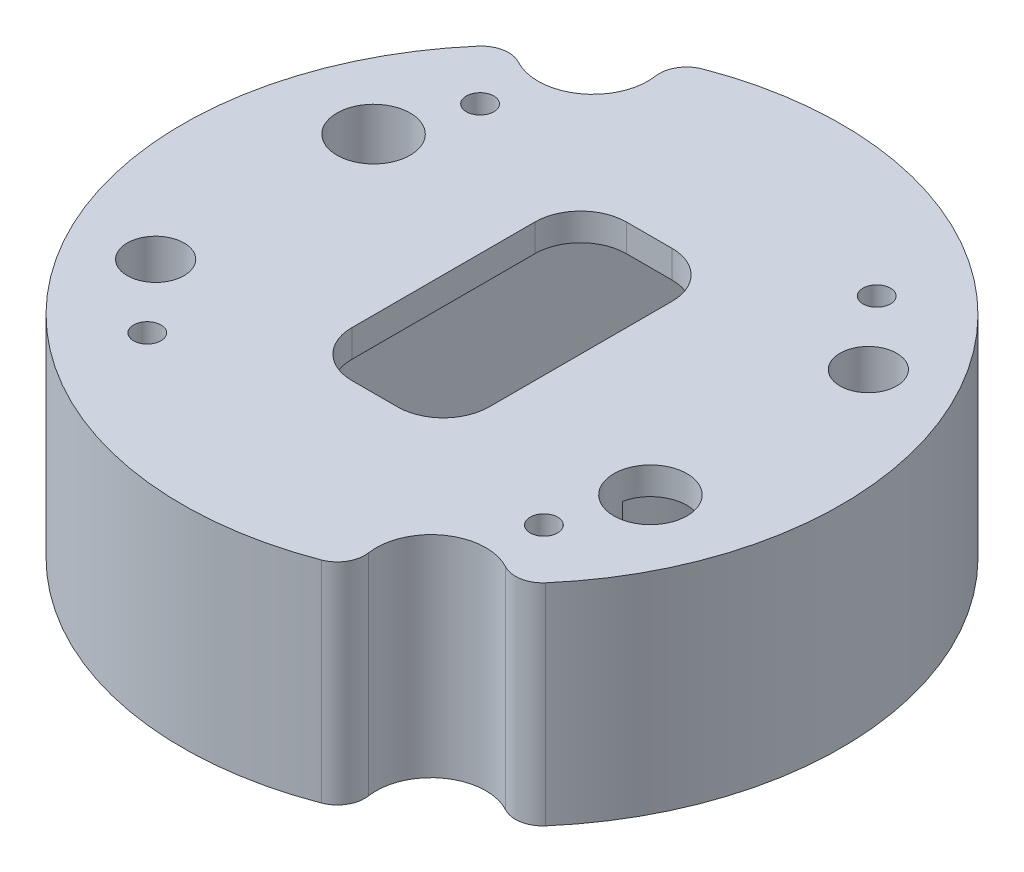
ISO-10303-21;
HEADER;
FILE_DESCRIPTION(('STEP AP214'),'2;1');
FILE_NAME('part.step','',(''),(''),'','','');
FILE_SCHEMA(('AUTOMOTIVE_DESIGN { 1 0 10303 214 1 1 1 1 }'));
ENDSEC;
DATA;
#1=APPLICATION_CONTEXT('core data for automotive mechanical design processes');
#2=APPLICATION_PROTOCOL_DEFINITION('international standard','automotive_design',2000,#1);
#3=PRODUCT_CONTEXT('',#1,'mechanical');
#4=PRODUCT('Part','Part','',(#3));
#5=PRODUCT_RELATED_PRODUCT_CATEGORY('part','',(#4));
#6=PRODUCT_DEFINITION_FORMATION('','',#4);
#7=PRODUCT_DEFINITION_CONTEXT('part definition',#1,'design');
#8=PRODUCT_DEFINITION('design','',#6,#7);
#9=PRODUCT_DEFINITION_SHAPE('','',#8);
#10=(LENGTH_UNIT() NAMED_UNIT(*) SI_UNIT(.MILLI.,.METRE.));
#11=(NAMED_UNIT(*) PLANE_ANGLE_UNIT() SI_UNIT($,.RADIAN.));
#12=(NAMED_UNIT(*) SI_UNIT($,.STERADIAN.) SOLID_ANGLE_UNIT());
#13=UNCERTAINTY_MEASURE_WITH_UNIT(LENGTH_MEASURE(1.E-05),#10,'distance_accuracy_value','');
#14=(GEOMETRIC_REPRESENTATION_CONTEXT(3) GLOBAL_UNCERTAINTY_ASSIGNED_CONTEXT((#13)) GLOBAL_UNIT_ASSIGNED_CONTEXT((#10,
#11,#12)) REPRESENTATION_CONTEXT('',''));
#15=CARTESIAN_POINT('',(0.,0.,0.));
#16=DIRECTION('',(0.,0.,1.));
#17=DIRECTION('',(1.,0.,0.));
#18=AXIS2_PLACEMENT_3D('',#15,#16,#17);
#19=CARTESIAN_POINT('',(0.,20.,0.));
#20=DIRECTION('',(0.,-1.,0.));
#21=DIRECTION('',(0.,0.,-1.));
#22=AXIS2_PLACEMENT_3D('',#19,#20,#21);
#23=CYLINDRICAL_SURFACE('',#22,36.);
#24=CARTESIAN_POINT('',(0.,0.,0.));
#25=DIRECTION('',(0.,1.,0.));
#26=DIRECTION('',(0.,0.,1.));
#27=AXIS2_PLACEMENT_3D('',#24,#25,#26);
#28=CIRCLE('',#27,36.);
#29=CARTESIAN_POINT('',(27.2276300501857,0.,23.5511392898566));
#30=VERTEX_POINT('',#29);
#31=CARTESIAN_POINT('',(-12.8184338695961,0.,-33.6405670750478));
#32=VERTEX_POINT('',#31);
#33=EDGE_CURVE('E250',#30,#32,#28,.T.);
#34=ORIENTED_EDGE('',*,*,#33,.T.);
#35=DIRECTION('',(0.,-1.,0.));
#36=VECTOR('',#35,1.);
#37=CARTESIAN_POINT('',(-12.8184338695961,20.,-33.6405670750478));
#38=LINE('',#37,#36);
#39=CARTESIAN_POINT('',(-12.8184338695961,23.,-33.6405670750478));
#40=VERTEX_POINT('',#39);
#41=EDGE_CURVE('E332',#32,#40,#38,.F.);
#42=ORIENTED_EDGE('',*,*,#41,.T.);
#43=CARTESIAN_POINT('',(0.,23.,0.));
#44=DIRECTION('',(0.,1.,0.));
#45=DIRECTION('',(0.,0.,1.));
#46=AXIS2_PLACEMENT_3D('',#43,#44,#45);
#47=CIRCLE('',#46,36.);
#48=CARTESIAN_POINT('',(27.2276300501857,23.,23.5511392898566));
#49=VERTEX_POINT('',#48);
#50=EDGE_CURVE('E254',#49,#40,#47,.T.);
#51=ORIENTED_EDGE('',*,*,#50,.F.);
#52=DIRECTION('',(0.,-1.,0.));
#53=VECTOR('',#52,1.);
#54=CARTESIAN_POINT('',(27.2276300501857,20.,23.5511392898566));
#55=LINE('',#54,#53);
#56=EDGE_CURVE('E330',#49,#30,#55,.T.);
#57=ORIENTED_EDGE('',*,*,#56,.T.);
#58=EDGE_LOOP('',(#34,#42,#51,#57));
#59=FACE_BOUND('',#58,.T.);
#60=ADVANCED_FACE('F45',(#59),#23,.T.);
#61=CARTESIAN_POINT('',(20.6487517086375,0.,29.4894735944038));
#62=DIRECTION('',(0.,1.,0.));
#63=DIRECTION('',(0.,0.,-1.));
#64=AXIS2_PLACEMENT_3D('',#61,#62,#63);
#65=CYLINDRICAL_SURFACE('',#64,6.);
#66=CARTESIAN_POINT('',(20.6487517086375,0.,29.4894735944038));
#67=DIRECTION('',(0.,1.,0.));
#68=DIRECTION('',(0.,0.,-1.));
#69=AXIS2_PLACEMENT_3D('',#66,#67,#68);
#70=CIRCLE('',#69,6.);
#71=CARTESIAN_POINT('',(23.5220244891038,0.,24.2221874308247));
#72=VERTEX_POINT('',#71);
#73=CARTESIAN_POINT('',(14.7164046009657,0.,30.3879488551083));
#74=VERTEX_POINT('',#73);
#75=EDGE_CURVE('E267',#72,#74,#70,.T.);
#76=ORIENTED_EDGE('',*,*,#75,.F.);
#77=DIRECTION('',(0.,1.,0.));
#78=VECTOR('',#77,1.);
#79=CARTESIAN_POINT('',(23.5220244891038,0.,24.2221874308247));
#80=LINE('',#79,#78);
#81=CARTESIAN_POINT('',(23.5220244891038,23.,24.2221874308247));
#82=VERTEX_POINT('',#81);
#83=EDGE_CURVE('E11',#72,#82,#80,.T.);
#84=ORIENTED_EDGE('',*,*,#83,.T.);
#85=CARTESIAN_POINT('',(20.6487517086375,23.,29.4894735944038));
#86=DIRECTION('',(0.,1.,0.));
#87=DIRECTION('',(0.,0.,-1.));
#88=AXIS2_PLACEMENT_3D('',#85,#86,#87);
#89=CIRCLE('',#88,6.);
#90=CARTESIAN_POINT('',(14.7164046009657,23.,30.3879488551083));
#91=VERTEX_POINT('',#90);
#92=EDGE_CURVE('E253',#91,#82,#89,.F.);
#93=ORIENTED_EDGE('',*,*,#92,.F.);
#94=DIRECTION('',(0.,1.,0.));
#95=VECTOR('',#94,1.);
#96=CARTESIAN_POINT('',(14.7164046009657,0.,30.3879488551083));
#97=LINE('',#96,#95);
#98=EDGE_CURVE('E53',#91,#74,#97,.F.);
#99=ORIENTED_EDGE('',*,*,#98,.T.);
#100=EDGE_LOOP('',(#76,#84,#93,#99));
#101=FACE_BOUND('',#100,.T.);
#102=ADVANCED_FACE('F458',(#101),#65,.F.);
#103=CARTESIAN_POINT('',(-8.,20.,34.3));
#104=DIRECTION('',(0.,0.,-1.));
#105=DIRECTION('',(-1.,0.,0.));
#106=AXIS2_PLACEMENT_3D('',#103,#104,#105);
#107=PLANE('',#106);
#108=DIRECTION('',(0.,-1.,0.));
#109=VECTOR('',#108,1.);
#110=CARTESIAN_POINT('',(-8.,20.,34.3));
#111=LINE('',#110,#109);
#112=CARTESIAN_POINT('',(-8.,20.,34.3));
#113=VERTEX_POINT('',#112);
#114=CARTESIAN_POINT('',(-8.,0.,34.3));
#115=VERTEX_POINT('',#114);
#116=EDGE_CURVE('E234',#113,#115,#111,.T.);
#117=ORIENTED_EDGE('',*,*,#116,.F.);
#118=DIRECTION('',(-1.,0.,0.));
#119=VECTOR('',#118,1.);
#120=CARTESIAN_POINT('',(0.,20.,34.3));
#121=LINE('',#120,#119);
#122=CARTESIAN_POINT('',(8.,20.,34.3));
#123=VERTEX_POINT('',#122);
#124=EDGE_CURVE('E381',#123,#113,#121,.T.);
#125=ORIENTED_EDGE('',*,*,#124,.F.);
#126=DIRECTION('',(0.,-1.,0.));
#127=VECTOR('',#126,1.);
#128=CARTESIAN_POINT('',(8.,20.,34.3));
#129=LINE('',#128,#127);
#130=CARTESIAN_POINT('',(8.,0.,34.3));
#131=VERTEX_POINT('',#130);
#132=EDGE_CURVE('E223',#123,#131,#129,.T.);
#133=ORIENTED_EDGE('',*,*,#132,.T.);
#134=DIRECTION('',(1.,0.,0.));
#135=VECTOR('',#134,1.);
#136=CARTESIAN_POINT('',(-8.,0.,34.3));
#137=LINE('',#136,#135);
#138=EDGE_CURVE('E520',#115,#131,#137,.T.);
#139=ORIENTED_EDGE('',*,*,#138,.F.);
#140=EDGE_LOOP('',(#117,#125,#133,#139));
#141=FACE_BOUND('',#140,.T.);
#142=ADVANCED_FACE('F464',(#141),#107,.T.);
#143=CARTESIAN_POINT('',(8.,20.,34.3));
#144=DIRECTION('',(-1.,0.,0.));
#145=DIRECTION('',(0.,0.,1.));
#146=AXIS2_PLACEMENT_3D('',#143,#144,#145);
#147=PLANE('',#146);
#148=ORIENTED_EDGE('',*,*,#132,.F.);
#149=DIRECTION('',(0.,0.,1.));
#150=VECTOR('',#149,1.);
#151=CARTESIAN_POINT('',(8.,20.,0.));
#152=LINE('',#151,#150);
#153=CARTESIAN_POINT('',(8.,20.,-34.3));
#154=VERTEX_POINT('',#153);
#155=EDGE_CURVE('E209',#154,#123,#152,.T.);
#156=ORIENTED_EDGE('',*,*,#155,.F.);
#157=DIRECTION('',(0.,-1.,0.));
#158=VECTOR('',#157,1.);
#159=CARTESIAN_POINT('',(8.,20.,-34.3));
#160=LINE('',#159,#158);
#161=CARTESIAN_POINT('',(8.,0.,-34.3));
#162=VERTEX_POINT('',#161);
#163=EDGE_CURVE('E221',#154,#162,#160,.T.);
#164=ORIENTED_EDGE('',*,*,#163,.T.);
#165=DIRECTION('',(0.,0.,-1.));
#166=VECTOR('',#165,1.);
#167=CARTESIAN_POINT('',(8.,0.,34.3));
#168=LINE('',#167,#166);
#169=EDGE_CURVE('E525',#131,#162,#168,.T.);
#170=ORIENTED_EDGE('',*,*,#169,.F.);
#171=EDGE_LOOP('',(#148,#156,#164,#170));
#172=FACE_BOUND('',#171,.T.);
#173=ADVANCED_FACE('F219',(#172),#147,.T.);
#174=CARTESIAN_POINT('',(8.,20.,-34.3));
#175=DIRECTION('',(0.,0.,1.));
#176=DIRECTION('',(1.,0.,0.));
#177=AXIS2_PLACEMENT_3D('',#174,#175,#176);
#178=PLANE('',#177);
#179=ORIENTED_EDGE('',*,*,#163,.F.);
#180=DIRECTION('',(1.,0.,0.));
#181=VECTOR('',#180,1.);
#182=CARTESIAN_POINT('',(0.,20.,-34.3));
#183=LINE('',#182,#181);
#184=CARTESIAN_POINT('',(-8.,20.,-34.3));
#185=VERTEX_POINT('',#184);
#186=EDGE_CURVE('E206',#185,#154,#183,.T.);
#187=ORIENTED_EDGE('',*,*,#186,.F.);
#188=DIRECTION('',(0.,-1.,0.));
#189=VECTOR('',#188,1.);
#190=CARTESIAN_POINT('',(-8.,20.,-34.3));
#191=LINE('',#190,#189);
#192=CARTESIAN_POINT('',(-8.,0.,-34.3));
#193=VERTEX_POINT('',#192);
#194=EDGE_CURVE('E230',#185,#193,#191,.T.);
#195=ORIENTED_EDGE('',*,*,#194,.T.);
#196=DIRECTION('',(-1.,0.,0.));
#197=VECTOR('',#196,1.);
#198=CARTESIAN_POINT('',(8.,0.,-34.3));
#199=LINE('',#198,#197);
#200=EDGE_CURVE('E228',#162,#193,#199,.T.);
#201=ORIENTED_EDGE('',*,*,#200,.F.);
#202=EDGE_LOOP('',(#179,#187,#195,#201));
#203=FACE_BOUND('',#202,.T.);
#204=ADVANCED_FACE('F226',(#203),#178,.T.);
#205=CARTESIAN_POINT('',(-8.,20.,-34.3));
#206=DIRECTION('',(1.,0.,0.));
#207=DIRECTION('',(0.,0.,-1.));
#208=AXIS2_PLACEMENT_3D('',#205,#206,#207);
#209=PLANE('',#208);
#210=ORIENTED_EDGE('',*,*,#194,.F.);
#211=DIRECTION('',(0.,0.,-1.));
#212=VECTOR('',#211,1.);
#213=CARTESIAN_POINT('',(-8.,20.,0.));
#214=LINE('',#213,#212);
#215=EDGE_CURVE('E212',#113,#185,#214,.T.);
#216=ORIENTED_EDGE('',*,*,#215,.F.);
#217=ORIENTED_EDGE('',*,*,#116,.T.);
#218=DIRECTION('',(0.,0.,1.));
#219=VECTOR('',#218,1.);
#220=CARTESIAN_POINT('',(-8.,0.,-34.3));
#221=LINE('',#220,#219);
#222=EDGE_CURVE('E528',#193,#115,#221,.T.);
#223=ORIENTED_EDGE('',*,*,#222,.F.);
#224=EDGE_LOOP('',(#210,#216,#217,#223));
#225=FACE_BOUND('',#224,.T.);
#226=ADVANCED_FACE('F478',(#225),#209,.T.);
#227=CARTESIAN_POINT('',(0.,0.,0.));
#228=DIRECTION('',(0.,1.,0.));
#229=DIRECTION('',(0.,0.,1.));
#230=AXIS2_PLACEMENT_3D('',#227,#228,#229);
#231=PLANE('',#230);
#232=CARTESIAN_POINT('',(-24.6817240078565,0.,14.25));
#233=DIRECTION('',(0.,1.,0.));
#234=DIRECTION('',(0.,0.,1.));
#235=AXIS2_PLACEMENT_3D('',#232,#233,#234);
#236=CIRCLE('',#235,3.1);
#237=CARTESIAN_POINT('',(-24.6817240078565,0.,17.35));
#238=VERTEX_POINT('',#237);
#239=EDGE_CURVE('E497',#238,#238,#236,.T.);
#240=ORIENTED_EDGE('',*,*,#239,.T.);
#241=EDGE_LOOP('',(#240));
#242=FACE_BOUND('',#241,.T.);
#243=CARTESIAN_POINT('',(24.6817240078565,0.,-14.25));
#244=DIRECTION('',(0.,1.,0.));
#245=DIRECTION('',(0.,0.,1.));
#246=AXIS2_PLACEMENT_3D('',#243,#244,#245);
#247=CIRCLE('',#246,3.1);
#248=CARTESIAN_POINT('',(24.6817240078565,0.,-11.15));
#249=VERTEX_POINT('',#248);
#250=EDGE_CURVE('E494',#249,#249,#247,.T.);
#251=ORIENTED_EDGE('',*,*,#250,.T.);
#252=EDGE_LOOP('',(#251));
#253=FACE_BOUND('',#252,.T.);
#254=CARTESIAN_POINT('',(-21.6670088167882,0.,-18.1807791068817));
#255=DIRECTION('',(0.,1.,0.));
#256=DIRECTION('',(0.,0.,1.));
#257=AXIS2_PLACEMENT_3D('',#254,#255,#256);
#258=CIRCLE('',#257,1.5);
#259=CARTESIAN_POINT('',(-21.6670088167882,0.,-16.6807791068817));
#260=VERTEX_POINT('',#259);
#261=EDGE_CURVE('E505',#260,#260,#258,.T.);
#262=ORIENTED_EDGE('',*,*,#261,.T.);
#263=EDGE_LOOP('',(#262));
#264=FACE_BOUND('',#263,.T.);
#265=CARTESIAN_POINT('',(18.1807791068817,0.,-21.6670088167881));
#266=DIRECTION('',(0.,1.,0.));
#267=DIRECTION('',(0.,0.,1.));
#268=AXIS2_PLACEMENT_3D('',#265,#266,#267);
#269=CIRCLE('',#268,1.5);
#270=CARTESIAN_POINT('',(18.1807791068817,0.,-20.1670088167881));
#271=VERTEX_POINT('',#270);
#272=EDGE_CURVE('E509',#271,#271,#269,.T.);
#273=ORIENTED_EDGE('',*,*,#272,.T.);
#274=EDGE_LOOP('',(#273));
#275=FACE_BOUND('',#274,.T.);
#276=CARTESIAN_POINT('',(-18.1807791068817,0.,21.6670088167882));
#277=DIRECTION('',(0.,1.,0.));
#278=DIRECTION('',(0.,0.,1.));
#279=AXIS2_PLACEMENT_3D('',#276,#277,#278);
#280=CIRCLE('',#279,1.5);
#281=CARTESIAN_POINT('',(-18.1807791068817,0.,23.1670088167882));
#282=VERTEX_POINT('',#281);
#283=EDGE_CURVE('E512',#282,#282,#280,.T.);
#284=ORIENTED_EDGE('',*,*,#283,.T.);
#285=EDGE_LOOP('',(#284));
#286=FACE_BOUND('',#285,.T.);
#287=CARTESIAN_POINT('',(21.6670088167881,0.,18.1807791068817));
#288=DIRECTION('',(0.,1.,0.));
#289=DIRECTION('',(0.,0.,1.));
#290=AXIS2_PLACEMENT_3D('',#287,#288,#289);
#291=CIRCLE('',#290,1.5);
#292=CARTESIAN_POINT('',(21.6670088167881,0.,19.6807791068817));
#293=VERTEX_POINT('',#292);
#294=EDGE_CURVE('E503',#293,#293,#291,.T.);
#295=ORIENTED_EDGE('',*,*,#294,.T.);
#296=EDGE_LOOP('',(#295));
#297=FACE_BOUND('',#296,.T.);
#298=CARTESIAN_POINT('',(24.625,0.,0.));
#299=DIRECTION('',(0.,1.,0.));
#300=DIRECTION('',(0.,0.,1.));
#301=AXIS2_PLACEMENT_3D('',#298,#299,#300);
#302=CIRCLE('',#301,9.50000000000001);
#303=CARTESIAN_POINT('',(28.5353527623172,0.,8.65789473684212));
#304=VERTEX_POINT('',#303);
#305=CARTESIAN_POINT('',(20.7146472376828,0.,8.65789473684212));
#306=VERTEX_POINT('',#305);
#307=EDGE_CURVE('E232',#304,#306,#302,.T.);
#308=ORIENTED_EDGE('',*,*,#307,.T.);
#309=CARTESIAN_POINT('',(24.625,0.,9.5));
#310=DIRECTION('',(0.,1.,0.));
#311=DIRECTION('',(0.,0.,1.));
#312=AXIS2_PLACEMENT_3D('',#309,#310,#311);
#313=CIRCLE('',#312,4.);
#314=EDGE_CURVE('E508',#306,#304,#313,.T.);
#315=ORIENTED_EDGE('',*,*,#314,.T.);
#316=EDGE_LOOP('',(#308,#315));
#317=FACE_BOUND('',#316,.T.);
#318=CARTESIAN_POINT('',(-24.625,0.,0.));
#319=DIRECTION('',(0.,1.,0.));
#320=DIRECTION('',(0.,0.,1.));
#321=AXIS2_PLACEMENT_3D('',#318,#319,#320);
#322=CIRCLE('',#321,9.5);
#323=CARTESIAN_POINT('',(-28.5353527623172,0.,-8.65789473684211));
#324=VERTEX_POINT('',#323);
#325=CARTESIAN_POINT('',(-20.7146472376828,0.,-8.65789473684211));
#326=VERTEX_POINT('',#325);
#327=EDGE_CURVE('E241',#324,#326,#322,.T.);
#328=ORIENTED_EDGE('',*,*,#327,.T.);
#329=CARTESIAN_POINT('',(-24.625,0.,-9.5));
#330=DIRECTION('',(0.,1.,0.));
#331=DIRECTION('',(0.,0.,1.));
#332=AXIS2_PLACEMENT_3D('',#329,#330,#331);
#333=CIRCLE('',#332,4.);
#334=EDGE_CURVE('E517',#326,#324,#333,.T.);
#335=ORIENTED_EDGE('',*,*,#334,.T.);
#336=EDGE_LOOP('',(#328,#335));
#337=FACE_BOUND('',#336,.T.);
#338=CARTESIAN_POINT('',(-27.2276300501857,0.,-23.5511392898566));
#339=VERTEX_POINT('',#338);
#340=CARTESIAN_POINT('',(12.8184338695961,0.,33.6405670750478));
#341=VERTEX_POINT('',#340);
#342=EDGE_CURVE('E247',#339,#341,#28,.T.);
#343=ORIENTED_EDGE('',*,*,#342,.F.);
#344=CARTESIAN_POINT('',(-24.9586608793369,0.,-21.5885443490352));
#345=DIRECTION('',(0.,1.,0.));
#346=DIRECTION('',(0.,0.,1.));
#347=AXIS2_PLACEMENT_3D('',#344,#345,#346);
#348=CIRCLE('',#347,3.);
#349=CARTESIAN_POINT('',(-23.5220244891038,0.,-24.2221874308247));
#350=VERTEX_POINT('',#349);
#351=EDGE_CURVE('E328',#339,#350,#348,.F.);
#352=ORIENTED_EDGE('',*,*,#351,.T.);
#353=CARTESIAN_POINT('',(-20.6487517086375,0.,-29.4894735944038));
#354=DIRECTION('',(0.,1.,0.));
#355=DIRECTION('',(0.,0.,1.));
#356=AXIS2_PLACEMENT_3D('',#353,#354,#355);
#357=CIRCLE('',#356,6.);
#358=CARTESIAN_POINT('',(-14.7164046009657,0.,-30.3879488551083));
#359=VERTEX_POINT('',#358);
#360=EDGE_CURVE('E354',#350,#359,#357,.T.);
#361=ORIENTED_EDGE('',*,*,#360,.T.);
#362=CARTESIAN_POINT('',(-11.7502310471298,0.,-30.8371864854605));
#363=DIRECTION('',(0.,1.,0.));
#364=DIRECTION('',(0.,0.,1.));
#365=AXIS2_PLACEMENT_3D('',#362,#363,#364);
#366=CIRCLE('',#365,3.);
#367=EDGE_CURVE('E326',#359,#32,#366,.F.);
#368=ORIENTED_EDGE('',*,*,#367,.T.);
#369=ORIENTED_EDGE('',*,*,#33,.F.);
#370=CARTESIAN_POINT('',(24.9586608793369,0.,21.5885443490352));
#371=DIRECTION('',(0.,1.,0.));
#372=DIRECTION('',(0.,0.,1.));
#373=AXIS2_PLACEMENT_3D('',#370,#371,#372);
#374=CIRCLE('',#373,3.);
#375=EDGE_CURVE('E66',#30,#72,#374,.F.);
#376=ORIENTED_EDGE('',*,*,#375,.T.);
#377=ORIENTED_EDGE('',*,*,#75,.T.);
#378=CARTESIAN_POINT('',(11.7502310471298,0.,30.8371864854605));
#379=DIRECTION('',(0.,1.,0.));
#380=DIRECTION('',(0.,0.,1.));
#381=AXIS2_PLACEMENT_3D('',#378,#379,#380);
#382=CIRCLE('',#381,3.);
#383=EDGE_CURVE('E323',#74,#341,#382,.F.);
#384=ORIENTED_EDGE('',*,*,#383,.T.);
#385=EDGE_LOOP('',(#343,#352,#361,#368,#369,#376,#377,#384));
#386=FACE_BOUND('',#385,.T.);
#387=ORIENTED_EDGE('',*,*,#138,.T.);
#388=ORIENTED_EDGE('',*,*,#169,.T.);
#389=ORIENTED_EDGE('',*,*,#200,.T.);
#390=ORIENTED_EDGE('',*,*,#222,.T.);
#391=EDGE_LOOP('',(#387,#388,#389,#390));
#392=FACE_BOUND('',#391,.T.);
#393=ADVANCED_FACE('F469',(#242,#253,#264,#275,#286,#297,#317,#337,#386,#392),#231,.F.);
#394=CARTESIAN_POINT('',(-27.2276300501857,23.,-23.5511392898566));
#395=VERTEX_POINT('',#394);
#396=CARTESIAN_POINT('',(12.8184338695961,23.,33.6405670750478));
#397=VERTEX_POINT('',#396);
#398=EDGE_CURVE('E347',#395,#397,#47,.T.);
#399=ORIENTED_EDGE('',*,*,#398,.F.);
#400=DIRECTION('',(0.,-1.,0.));
#401=VECTOR('',#400,1.);
#402=CARTESIAN_POINT('',(-27.2276300501857,20.,-23.5511392898566));
#403=LINE('',#402,#401);
#404=EDGE_CURVE('E321',#395,#339,#403,.T.);
#405=ORIENTED_EDGE('',*,*,#404,.T.);
#406=ORIENTED_EDGE('',*,*,#342,.T.);
#407=DIRECTION('',(0.,-1.,0.));
#408=VECTOR('',#407,1.);
#409=CARTESIAN_POINT('',(12.8184338695961,20.,33.6405670750478));
#410=LINE('',#409,#408);
#411=EDGE_CURVE('E318',#341,#397,#410,.F.);
#412=ORIENTED_EDGE('',*,*,#411,.T.);
#413=EDGE_LOOP('',(#399,#405,#406,#412));
#414=FACE_BOUND('',#413,.T.);
#415=ADVANCED_FACE('F460',(#414),#23,.T.);
#416=CARTESIAN_POINT('',(-24.625,20.,0.));
#417=DIRECTION('',(0.,-1.,0.));
#418=DIRECTION('',(0.,0.,-1.));
#419=AXIS2_PLACEMENT_3D('',#416,#417,#418);
#420=CYLINDRICAL_SURFACE('',#419,9.5);
#421=DIRECTION('',(0.,1.,0.));
#422=VECTOR('',#421,1.);
#423=CARTESIAN_POINT('',(-20.7146472376828,10.,-8.65789473684211));
#424=LINE('',#423,#422);
#425=CARTESIAN_POINT('',(-20.7146472376828,20.,-8.65789473684211));
#426=VERTEX_POINT('',#425);
#427=EDGE_CURVE('E262',#326,#426,#424,.T.);
#428=ORIENTED_EDGE('',*,*,#427,.F.);
#429=ORIENTED_EDGE('',*,*,#327,.F.);
#430=DIRECTION('',(0.,1.,0.));
#431=VECTOR('',#430,1.);
#432=CARTESIAN_POINT('',(-28.5353527623172,10.,-8.65789473684211));
#433=LINE('',#432,#431);
#434=CARTESIAN_POINT('',(-28.5353527623172,20.,-8.65789473684211));
#435=VERTEX_POINT('',#434);
#436=EDGE_CURVE('E260',#435,#324,#433,.F.);
#437=ORIENTED_EDGE('',*,*,#436,.F.);
#438=CARTESIAN_POINT('',(-24.625,20.,0.));
#439=DIRECTION('',(0.,1.,0.));
#440=DIRECTION('',(0.,0.,1.));
#441=AXIS2_PLACEMENT_3D('',#438,#439,#440);
#442=CIRCLE('',#441,9.5);
#443=EDGE_CURVE('E244',#435,#426,#442,.T.);
#444=ORIENTED_EDGE('',*,*,#443,.T.);
#445=EDGE_LOOP('',(#428,#429,#437,#444));
#446=FACE_BOUND('',#445,.T.);
#447=ADVANCED_FACE('F468',(#446),#420,.F.);
#448=CARTESIAN_POINT('',(24.625,20.,0.));
#449=DIRECTION('',(0.,-1.,0.));
#450=DIRECTION('',(0.,0.,-1.));
#451=AXIS2_PLACEMENT_3D('',#448,#449,#450);
#452=CYLINDRICAL_SURFACE('',#451,9.50000000000001);
#453=DIRECTION('',(0.,1.,0.));
#454=VECTOR('',#453,1.);
#455=CARTESIAN_POINT('',(20.7146472376828,10.,8.65789473684212));
#456=LINE('',#455,#454);
#457=CARTESIAN_POINT('',(20.7146472376828,20.,8.65789473684212));
#458=VERTEX_POINT('',#457);
#459=EDGE_CURVE('E257',#306,#458,#456,.T.);
#460=ORIENTED_EDGE('',*,*,#459,.F.);
#461=ORIENTED_EDGE('',*,*,#307,.F.);
#462=DIRECTION('',(0.,1.,0.));
#463=VECTOR('',#462,1.);
#464=CARTESIAN_POINT('',(28.5353527623172,10.,8.65789473684212));
#465=LINE('',#464,#463);
#466=CARTESIAN_POINT('',(28.5353527623172,20.,8.65789473684212));
#467=VERTEX_POINT('',#466);
#468=EDGE_CURVE('E255',#467,#304,#465,.F.);
#469=ORIENTED_EDGE('',*,*,#468,.F.);
#470=CARTESIAN_POINT('',(24.625,20.,0.));
#471=DIRECTION('',(0.,1.,0.));
#472=DIRECTION('',(0.,0.,1.));
#473=AXIS2_PLACEMENT_3D('',#470,#471,#472);
#474=CIRCLE('',#473,9.50000000000001);
#475=EDGE_CURVE('E238',#467,#458,#474,.T.);
#476=ORIENTED_EDGE('',*,*,#475,.T.);
#477=EDGE_LOOP('',(#460,#461,#469,#476));
#478=FACE_BOUND('',#477,.T.);
#479=ADVANCED_FACE('F475',(#478),#452,.F.);
#480=CARTESIAN_POINT('',(24.625,0.,9.5));
#481=DIRECTION('',(0.,1.,0.));
#482=DIRECTION('',(0.,0.,1.));
#483=AXIS2_PLACEMENT_3D('',#480,#481,#482);
#484=CYLINDRICAL_SURFACE('',#483,4.);
#485=ORIENTED_EDGE('',*,*,#459,.T.);
#486=CARTESIAN_POINT('',(24.625,20.,9.5));
#487=DIRECTION('',(0.,1.,0.));
#488=DIRECTION('',(0.,0.,1.));
#489=AXIS2_PLACEMENT_3D('',#486,#487,#488);
#490=CIRCLE('',#489,4.);
#491=EDGE_CURVE('E380',#458,#467,#490,.F.);
#492=ORIENTED_EDGE('',*,*,#491,.T.);
#493=ORIENTED_EDGE('',*,*,#468,.T.);
#494=ORIENTED_EDGE('',*,*,#314,.F.);
#495=EDGE_LOOP('',(#485,#492,#493,#494));
#496=FACE_BOUND('',#495,.T.);
#497=CARTESIAN_POINT('',(24.625,23.,9.5));
#498=DIRECTION('',(0.,1.,0.));
#499=DIRECTION('',(0.,0.,1.));
#500=AXIS2_PLACEMENT_3D('',#497,#498,#499);
#501=CIRCLE('',#500,4.);
#502=CARTESIAN_POINT('',(24.625,23.,13.5));
#503=VERTEX_POINT('',#502);
#504=EDGE_CURVE('E365',#503,#503,#501,.F.);
#505=ORIENTED_EDGE('',*,*,#504,.F.);
#506=EDGE_LOOP('',(#505));
#507=FACE_BOUND('',#506,.T.);
#508=ADVANCED_FACE('F544',(#496,#507),#484,.F.);
#509=CARTESIAN_POINT('',(-24.625,0.,-9.5));
#510=DIRECTION('',(0.,1.,0.));
#511=DIRECTION('',(0.,0.,1.));
#512=AXIS2_PLACEMENT_3D('',#509,#510,#511);
#513=CYLINDRICAL_SURFACE('',#512,4.);
#514=ORIENTED_EDGE('',*,*,#427,.T.);
#515=CARTESIAN_POINT('',(-24.625,20.,-9.5));
#516=DIRECTION('',(0.,1.,0.));
#517=DIRECTION('',(0.,0.,1.));
#518=AXIS2_PLACEMENT_3D('',#515,#516,#517);
#519=CIRCLE('',#518,4.);
#520=EDGE_CURVE('E399',#426,#435,#519,.F.);
#521=ORIENTED_EDGE('',*,*,#520,.T.);
#522=ORIENTED_EDGE('',*,*,#436,.T.);
#523=ORIENTED_EDGE('',*,*,#334,.F.);
#524=EDGE_LOOP('',(#514,#521,#522,#523));
#525=FACE_BOUND('',#524,.T.);
#526=CARTESIAN_POINT('',(-24.625,23.,-9.5));
#527=DIRECTION('',(0.,1.,0.));
#528=DIRECTION('',(0.,0.,1.));
#529=AXIS2_PLACEMENT_3D('',#526,#527,#528);
#530=CIRCLE('',#529,4.);
#531=CARTESIAN_POINT('',(-24.625,23.,-5.5));
#532=VERTEX_POINT('',#531);
#533=EDGE_CURVE('E368',#532,#532,#530,.F.);
#534=ORIENTED_EDGE('',*,*,#533,.F.);
#535=EDGE_LOOP('',(#534));
#536=FACE_BOUND('',#535,.T.);
#537=ADVANCED_FACE('F549',(#525,#536),#513,.F.);
#538=CARTESIAN_POINT('',(21.6670088167881,0.,18.1807791068817));
#539=DIRECTION('',(0.,1.,0.));
#540=DIRECTION('',(0.,0.,1.));
#541=AXIS2_PLACEMENT_3D('',#538,#539,#540);
#542=CYLINDRICAL_SURFACE('',#541,1.5);
#543=ORIENTED_EDGE('',*,*,#294,.F.);
#544=EDGE_LOOP('',(#543));
#545=FACE_BOUND('',#544,.T.);
#546=CARTESIAN_POINT('',(21.6670088167881,23.,18.1807791068817));
#547=DIRECTION('',(0.,1.,0.));
#548=DIRECTION('',(0.,0.,1.));
#549=AXIS2_PLACEMENT_3D('',#546,#547,#548);
#550=CIRCLE('',#549,1.5);
#551=CARTESIAN_POINT('',(21.6670088167881,23.,19.6807791068817));
#552=VERTEX_POINT('',#551);
#553=EDGE_CURVE('E360',#552,#552,#550,.F.);
#554=ORIENTED_EDGE('',*,*,#553,.F.);
#555=EDGE_LOOP('',(#554));
#556=FACE_BOUND('',#555,.T.);
#557=ADVANCED_FACE('F591',(#545,#556),#542,.F.);
#558=CARTESIAN_POINT('',(-18.1807791068817,0.,21.6670088167882));
#559=DIRECTION('',(0.,1.,0.));
#560=DIRECTION('',(0.,0.,1.));
#561=AXIS2_PLACEMENT_3D('',#558,#559,#560);
#562=CYLINDRICAL_SURFACE('',#561,1.5);
#563=ORIENTED_EDGE('',*,*,#283,.F.);
#564=EDGE_LOOP('',(#563));
#565=FACE_BOUND('',#564,.T.);
#566=CARTESIAN_POINT('',(-18.1807791068817,23.,21.6670088167882));
#567=DIRECTION('',(0.,1.,0.));
#568=DIRECTION('',(0.,0.,1.));
#569=AXIS2_PLACEMENT_3D('',#566,#567,#568);
#570=CIRCLE('',#569,1.5);
#571=CARTESIAN_POINT('',(-18.1807791068817,23.,23.1670088167882));
#572=VERTEX_POINT('',#571);
#573=EDGE_CURVE('E371',#572,#572,#570,.F.);
#574=ORIENTED_EDGE('',*,*,#573,.F.);
#575=EDGE_LOOP('',(#574));
#576=FACE_BOUND('',#575,.T.);
#577=ADVANCED_FACE('F587',(#565,#576),#562,.F.);
#578=CARTESIAN_POINT('',(18.1807791068817,0.,-21.6670088167881));
#579=DIRECTION('',(0.,1.,0.));
#580=DIRECTION('',(0.,0.,1.));
#581=AXIS2_PLACEMENT_3D('',#578,#579,#580);
#582=CYLINDRICAL_SURFACE('',#581,1.5);
#583=ORIENTED_EDGE('',*,*,#272,.F.);
#584=EDGE_LOOP('',(#583));
#585=FACE_BOUND('',#584,.T.);
#586=CARTESIAN_POINT('',(18.1807791068817,23.,-21.6670088167881));
#587=DIRECTION('',(0.,1.,0.));
#588=DIRECTION('',(0.,0.,1.));
#589=AXIS2_PLACEMENT_3D('',#586,#587,#588);
#590=CIRCLE('',#589,1.5);
#591=CARTESIAN_POINT('',(18.1807791068817,23.,-20.1670088167881));
#592=VERTEX_POINT('',#591);
#593=EDGE_CURVE('E356',#592,#592,#590,.F.);
#594=ORIENTED_EDGE('',*,*,#593,.F.);
#595=EDGE_LOOP('',(#594));
#596=FACE_BOUND('',#595,.T.);
#597=ADVANCED_FACE('F583',(#585,#596),#582,.F.);
#598=CARTESIAN_POINT('',(-21.6670088167882,0.,-18.1807791068817));
#599=DIRECTION('',(0.,1.,0.));
#600=DIRECTION('',(0.,0.,1.));
#601=AXIS2_PLACEMENT_3D('',#598,#599,#600);
#602=CYLINDRICAL_SURFACE('',#601,1.5);
#603=ORIENTED_EDGE('',*,*,#261,.F.);
#604=EDGE_LOOP('',(#603));
#605=FACE_BOUND('',#604,.T.);
#606=CARTESIAN_POINT('',(-21.6670088167882,23.,-18.1807791068817));
#607=DIRECTION('',(0.,1.,0.));
#608=DIRECTION('',(0.,0.,1.));
#609=AXIS2_PLACEMENT_3D('',#606,#607,#608);
#610=CIRCLE('',#609,1.5);
#611=CARTESIAN_POINT('',(-21.6670088167882,23.,-16.6807791068817));
#612=VERTEX_POINT('',#611);
#613=EDGE_CURVE('E374',#612,#612,#610,.F.);
#614=ORIENTED_EDGE('',*,*,#613,.F.);
#615=EDGE_LOOP('',(#614));
#616=FACE_BOUND('',#615,.T.);
#617=ADVANCED_FACE('F579',(#605,#616),#602,.F.);
#618=CARTESIAN_POINT('',(24.6817240078565,0.,-14.25));
#619=DIRECTION('',(0.,1.,0.));
#620=DIRECTION('',(0.,0.,1.));
#621=AXIS2_PLACEMENT_3D('',#618,#619,#620);
#622=CYLINDRICAL_SURFACE('',#621,3.1);
#623=ORIENTED_EDGE('',*,*,#250,.F.);
#624=EDGE_LOOP('',(#623));
#625=FACE_BOUND('',#624,.T.);
#626=CARTESIAN_POINT('',(24.6817240078565,23.,-14.25));
#627=DIRECTION('',(0.,1.,0.));
#628=DIRECTION('',(0.,0.,1.));
#629=AXIS2_PLACEMENT_3D('',#626,#627,#628);
#630=CIRCLE('',#629,3.1);
#631=CARTESIAN_POINT('',(24.6817240078565,23.,-11.15));
#632=VERTEX_POINT('',#631);
#633=EDGE_CURVE('E352',#632,#632,#630,.F.);
#634=ORIENTED_EDGE('',*,*,#633,.F.);
#635=EDGE_LOOP('',(#634));
#636=FACE_BOUND('',#635,.T.);
#637=ADVANCED_FACE('F575',(#625,#636),#622,.F.);
#638=CARTESIAN_POINT('',(-24.6817240078565,0.,14.25));
#639=DIRECTION('',(0.,1.,0.));
#640=DIRECTION('',(0.,0.,1.));
#641=AXIS2_PLACEMENT_3D('',#638,#639,#640);
#642=CYLINDRICAL_SURFACE('',#641,3.1);
#643=ORIENTED_EDGE('',*,*,#239,.F.);
#644=EDGE_LOOP('',(#643));
#645=FACE_BOUND('',#644,.T.);
#646=CARTESIAN_POINT('',(-24.6817240078565,23.,14.25));
#647=DIRECTION('',(0.,1.,0.));
#648=DIRECTION('',(0.,0.,1.));
#649=AXIS2_PLACEMENT_3D('',#646,#647,#648);
#650=CIRCLE('',#649,3.1);
#651=CARTESIAN_POINT('',(-24.6817240078565,23.,17.35));
#652=VERTEX_POINT('',#651);
#653=EDGE_CURVE('E377',#652,#652,#650,.F.);
#654=ORIENTED_EDGE('',*,*,#653,.F.);
#655=EDGE_LOOP('',(#654));
#656=FACE_BOUND('',#655,.T.);
#657=ADVANCED_FACE('F570',(#645,#656),#642,.F.);
#658=CARTESIAN_POINT('',(-20.6487517086375,0.,-29.4894735944038));
#659=DIRECTION('',(0.,1.,0.));
#660=DIRECTION('',(0.,0.,1.));
#661=AXIS2_PLACEMENT_3D('',#658,#659,#660);
#662=CYLINDRICAL_SURFACE('',#661,6.);
#663=ORIENTED_EDGE('',*,*,#360,.F.);
#664=DIRECTION('',(0.,1.,0.));
#665=VECTOR('',#664,1.);
#666=CARTESIAN_POINT('',(-23.5220244891038,0.,-24.2221874308247));
#667=LINE('',#666,#665);
#668=CARTESIAN_POINT('',(-23.5220244891038,23.,-24.2221874308247));
#669=VERTEX_POINT('',#668);
#670=EDGE_CURVE('E307',#350,#669,#667,.T.);
#671=ORIENTED_EDGE('',*,*,#670,.T.);
#672=CARTESIAN_POINT('',(-20.6487517086375,23.,-29.4894735944038));
#673=DIRECTION('',(0.,1.,0.));
#674=DIRECTION('',(0.,0.,1.));
#675=AXIS2_PLACEMENT_3D('',#672,#673,#674);
#676=CIRCLE('',#675,6.);
#677=CARTESIAN_POINT('',(-14.7164046009657,23.,-30.3879488551083));
#678=VERTEX_POINT('',#677);
#679=EDGE_CURVE('E351',#678,#669,#676,.F.);
#680=ORIENTED_EDGE('',*,*,#679,.F.);
#681=DIRECTION('',(0.,1.,0.));
#682=VECTOR('',#681,1.);
#683=CARTESIAN_POINT('',(-14.7164046009657,0.,-30.3879488551083));
#684=LINE('',#683,#682);
#685=EDGE_CURVE('E305',#678,#359,#684,.F.);
#686=ORIENTED_EDGE('',*,*,#685,.T.);
#687=EDGE_LOOP('',(#663,#671,#680,#686));
#688=FACE_BOUND('',#687,.T.);
#689=ADVANCED_FACE('F492',(#688),#662,.F.);
#690=CARTESIAN_POINT('',(0.,20.,0.));
#691=DIRECTION('',(0.,1.,0.));
#692=DIRECTION('',(0.,0.,1.));
#693=AXIS2_PLACEMENT_3D('',#690,#691,#692);
#694=PLANE('',#693);
#695=ORIENTED_EDGE('',*,*,#443,.F.);
#696=ORIENTED_EDGE('',*,*,#520,.F.);
#697=EDGE_LOOP('',(#695,#696));
#698=FACE_BOUND('',#697,.T.);
#699=ADVANCED_FACE('F453',(#698),#694,.F.);
#700=ORIENTED_EDGE('',*,*,#475,.F.);
#701=ORIENTED_EDGE('',*,*,#491,.F.);
#702=EDGE_LOOP('',(#700,#701));
#703=FACE_BOUND('',#702,.T.);
#704=ADVANCED_FACE('F445',(#703),#694,.F.);
#705=CARTESIAN_POINT('',(0.,23.,0.));
#706=DIRECTION('',(0.,1.,0.));
#707=DIRECTION('',(0.,0.,1.));
#708=AXIS2_PLACEMENT_3D('',#705,#706,#707);
#709=PLANE('',#708);
#710=ORIENTED_EDGE('',*,*,#653,.T.);
#711=EDGE_LOOP('',(#710));
#712=FACE_BOUND('',#711,.T.);
#713=ORIENTED_EDGE('',*,*,#613,.T.);
#714=EDGE_LOOP('',(#713));
#715=FACE_BOUND('',#714,.T.);
#716=ORIENTED_EDGE('',*,*,#573,.T.);
#717=EDGE_LOOP('',(#716));
#718=FACE_BOUND('',#717,.T.);
#719=ORIENTED_EDGE('',*,*,#533,.T.);
#720=EDGE_LOOP('',(#719));
#721=FACE_BOUND('',#720,.T.);
#722=ORIENTED_EDGE('',*,*,#504,.T.);
#723=EDGE_LOOP('',(#722));
#724=FACE_BOUND('',#723,.T.);
#725=ORIENTED_EDGE('',*,*,#553,.T.);
#726=EDGE_LOOP('',(#725));
#727=FACE_BOUND('',#726,.T.);
#728=ORIENTED_EDGE('',*,*,#593,.T.);
#729=EDGE_LOOP('',(#728));
#730=FACE_BOUND('',#729,.T.);
#731=ORIENTED_EDGE('',*,*,#633,.T.);
#732=EDGE_LOOP('',(#731));
#733=FACE_BOUND('',#732,.T.);
#734=ORIENTED_EDGE('',*,*,#679,.T.);
#735=CARTESIAN_POINT('',(-24.9586608793369,23.,-21.5885443490352));
#736=DIRECTION('',(0.,1.,0.));
#737=DIRECTION('',(0.,0.,1.));
#738=AXIS2_PLACEMENT_3D('',#735,#736,#737);
#739=CIRCLE('',#738,3.);
#740=EDGE_CURVE('E316',#669,#395,#739,.T.);
#741=ORIENTED_EDGE('',*,*,#740,.T.);
#742=ORIENTED_EDGE('',*,*,#398,.T.);
#743=CARTESIAN_POINT('',(11.7502310471298,23.,30.8371864854605));
#744=DIRECTION('',(0.,1.,0.));
#745=DIRECTION('',(0.,0.,1.));
#746=AXIS2_PLACEMENT_3D('',#743,#744,#745);
#747=CIRCLE('',#746,3.);
#748=EDGE_CURVE('E310',#397,#91,#747,.T.);
#749=ORIENTED_EDGE('',*,*,#748,.T.);
#750=ORIENTED_EDGE('',*,*,#92,.T.);
#751=CARTESIAN_POINT('',(24.9586608793369,23.,21.5885443490352));
#752=DIRECTION('',(0.,1.,0.));
#753=DIRECTION('',(0.,0.,1.));
#754=AXIS2_PLACEMENT_3D('',#751,#752,#753);
#755=CIRCLE('',#754,3.);
#756=EDGE_CURVE('E312',#82,#49,#755,.T.);
#757=ORIENTED_EDGE('',*,*,#756,.T.);
#758=ORIENTED_EDGE('',*,*,#50,.T.);
#759=CARTESIAN_POINT('',(-11.7502310471298,23.,-30.8371864854605));
#760=DIRECTION('',(0.,1.,0.));
#761=DIRECTION('',(0.,0.,1.));
#762=AXIS2_PLACEMENT_3D('',#759,#760,#761);
#763=CIRCLE('',#762,3.);
#764=EDGE_CURVE('E314',#40,#678,#763,.T.);
#765=ORIENTED_EDGE('',*,*,#764,.T.);
#766=EDGE_LOOP('',(#734,#741,#742,#749,#750,#757,#758,#765));
#767=FACE_BOUND('',#766,.T.);
#768=DIRECTION('',(0.,0.,-1.));
#769=VECTOR('',#768,1.);
#770=CARTESIAN_POINT('',(7.5,23.,0.));
#771=LINE('',#770,#769);
#772=CARTESIAN_POINT('',(7.5,23.,10.));
#773=VERTEX_POINT('',#772);
#774=CARTESIAN_POINT('',(7.5,23.,-10.));
#775=VERTEX_POINT('',#774);
#776=EDGE_CURVE('E383',#773,#775,#771,.T.);
#777=ORIENTED_EDGE('',*,*,#776,.F.);
#778=CARTESIAN_POINT('',(2.5,23.,10.));
#779=DIRECTION('',(0.,1.,0.));
#780=DIRECTION('',(0.,0.,1.));
#781=AXIS2_PLACEMENT_3D('',#778,#779,#780);
#782=CIRCLE('',#781,5.);
#783=CARTESIAN_POINT('',(2.5,23.,15.));
#784=VERTEX_POINT('',#783);
#785=EDGE_CURVE('E291',#773,#784,#782,.F.);
#786=ORIENTED_EDGE('',*,*,#785,.T.);
#787=DIRECTION('',(1.,0.,0.));
#788=VECTOR('',#787,1.);
#789=CARTESIAN_POINT('',(0.,23.,15.));
#790=LINE('',#789,#788);
#791=CARTESIAN_POINT('',(-2.5,23.,15.));
#792=VERTEX_POINT('',#791);
#793=EDGE_CURVE('E403',#792,#784,#790,.T.);
#794=ORIENTED_EDGE('',*,*,#793,.F.);
#795=CARTESIAN_POINT('',(-2.5,23.,10.));
#796=DIRECTION('',(0.,1.,0.));
#797=DIRECTION('',(0.,0.,1.));
#798=AXIS2_PLACEMENT_3D('',#795,#796,#797);
#799=CIRCLE('',#798,5.);
#800=CARTESIAN_POINT('',(-7.5,23.,10.));
#801=VERTEX_POINT('',#800);
#802=EDGE_CURVE('E295',#792,#801,#799,.F.);
#803=ORIENTED_EDGE('',*,*,#802,.T.);
#804=DIRECTION('',(0.,0.,-1.));
#805=VECTOR('',#804,1.);
#806=CARTESIAN_POINT('',(-7.5,23.,0.));
#807=LINE('',#806,#805);
#808=CARTESIAN_POINT('',(-7.5,23.,-10.));
#809=VERTEX_POINT('',#808);
#810=EDGE_CURVE('E400',#801,#809,#807,.T.);
#811=ORIENTED_EDGE('',*,*,#810,.T.);
#812=CARTESIAN_POINT('',(-2.5,23.,-10.));
#813=DIRECTION('',(0.,1.,0.));
#814=DIRECTION('',(0.,0.,1.));
#815=AXIS2_PLACEMENT_3D('',#812,#813,#814);
#816=CIRCLE('',#815,5.);
#817=CARTESIAN_POINT('',(-2.5,23.,-15.));
#818=VERTEX_POINT('',#817);
#819=EDGE_CURVE('E303',#809,#818,#816,.F.);
#820=ORIENTED_EDGE('',*,*,#819,.T.);
#821=DIRECTION('',(1.,0.,0.));
#822=VECTOR('',#821,1.);
#823=CARTESIAN_POINT('',(0.,23.,-15.));
#824=LINE('',#823,#822);
#825=CARTESIAN_POINT('',(2.5,23.,-15.));
#826=VERTEX_POINT('',#825);
#827=EDGE_CURVE('E396',#818,#826,#824,.T.);
#828=ORIENTED_EDGE('',*,*,#827,.T.);
#829=CARTESIAN_POINT('',(2.5,23.,-10.));
#830=DIRECTION('',(0.,1.,0.));
#831=DIRECTION('',(0.,0.,1.));
#832=AXIS2_PLACEMENT_3D('',#829,#830,#831);
#833=CIRCLE('',#832,5.);
#834=EDGE_CURVE('E299',#826,#775,#833,.F.);
#835=ORIENTED_EDGE('',*,*,#834,.T.);
#836=EDGE_LOOP('',(#777,#786,#794,#803,#811,#820,#828,#835));
#837=FACE_BOUND('',#836,.T.);
#838=ADVANCED_FACE('F343',(#712,#715,#718,#721,#724,#727,#730,#733,#767,#837),#709,.T.);
#839=CARTESIAN_POINT('',(7.5,23.,0.));
#840=DIRECTION('',(-1.,0.,0.));
#841=DIRECTION('',(0.,0.,1.));
#842=AXIS2_PLACEMENT_3D('',#839,#840,#841);
#843=PLANE('',#842);
#844=DIRECTION('',(0.,0.,-1.));
#845=VECTOR('',#844,1.);
#846=CARTESIAN_POINT('',(7.5,20.,0.));
#847=LINE('',#846,#845);
#848=CARTESIAN_POINT('',(7.5,20.,10.));
#849=VERTEX_POINT('',#848);
#850=CARTESIAN_POINT('',(7.5,20.,-10.));
#851=VERTEX_POINT('',#850);
#852=EDGE_CURVE('E393',#849,#851,#847,.T.);
#853=ORIENTED_EDGE('',*,*,#852,.F.);
#854=DIRECTION('',(0.,-1.,0.));
#855=VECTOR('',#854,1.);
#856=CARTESIAN_POINT('',(7.5,23.,10.));
#857=LINE('',#856,#855);
#858=EDGE_CURVE('E277',#849,#773,#857,.F.);
#859=ORIENTED_EDGE('',*,*,#858,.T.);
#860=ORIENTED_EDGE('',*,*,#776,.T.);
#861=DIRECTION('',(0.,-1.,0.));
#862=VECTOR('',#861,1.);
#863=CARTESIAN_POINT('',(7.5,23.,-10.));
#864=LINE('',#863,#862);
#865=EDGE_CURVE('E274',#775,#851,#864,.T.);
#866=ORIENTED_EDGE('',*,*,#865,.T.);
#867=EDGE_LOOP('',(#853,#859,#860,#866));
#868=FACE_BOUND('',#867,.T.);
#869=ADVANCED_FACE('F411',(#868),#843,.T.);
#870=CARTESIAN_POINT('',(0.,23.,15.));
#871=DIRECTION('',(0.,0.,-1.));
#872=DIRECTION('',(-1.,0.,0.));
#873=AXIS2_PLACEMENT_3D('',#870,#871,#872);
#874=PLANE('',#873);
#875=ORIENTED_EDGE('',*,*,#793,.T.);
#876=DIRECTION('',(0.,-1.,0.));
#877=VECTOR('',#876,1.);
#878=CARTESIAN_POINT('',(2.5,20.,15.));
#879=LINE('',#878,#877);
#880=CARTESIAN_POINT('',(2.5,20.,15.));
#881=VERTEX_POINT('',#880);
#882=EDGE_CURVE('E271',#784,#881,#879,.T.);
#883=ORIENTED_EDGE('',*,*,#882,.T.);
#884=DIRECTION('',(1.,0.,0.));
#885=VECTOR('',#884,1.);
#886=CARTESIAN_POINT('',(0.,20.,15.));
#887=LINE('',#886,#885);
#888=CARTESIAN_POINT('',(-2.5,20.,15.));
#889=VERTEX_POINT('',#888);
#890=EDGE_CURVE('E390',#889,#881,#887,.T.);
#891=ORIENTED_EDGE('',*,*,#890,.F.);
#892=DIRECTION('',(0.,-1.,0.));
#893=VECTOR('',#892,1.);
#894=CARTESIAN_POINT('',(-2.5,23.,15.));
#895=LINE('',#894,#893);
#896=EDGE_CURVE('E269',#889,#792,#895,.F.);
#897=ORIENTED_EDGE('',*,*,#896,.T.);
#898=EDGE_LOOP('',(#875,#883,#891,#897));
#899=FACE_BOUND('',#898,.T.);
#900=ADVANCED_FACE('F439',(#899),#874,.T.);
#901=CARTESIAN_POINT('',(-7.5,23.,0.));
#902=DIRECTION('',(-1.,0.,0.));
#903=DIRECTION('',(0.,0.,1.));
#904=AXIS2_PLACEMENT_3D('',#901,#902,#903);
#905=PLANE('',#904);
#906=ORIENTED_EDGE('',*,*,#810,.F.);
#907=DIRECTION('',(0.,-1.,0.));
#908=VECTOR('',#907,1.);
#909=CARTESIAN_POINT('',(-7.5,23.,10.));
#910=LINE('',#909,#908);
#911=CARTESIAN_POINT('',(-7.5,20.,10.));
#912=VERTEX_POINT('',#911);
#913=EDGE_CURVE('E281',#801,#912,#910,.T.);
#914=ORIENTED_EDGE('',*,*,#913,.T.);
#915=DIRECTION('',(0.,0.,-1.));
#916=VECTOR('',#915,1.);
#917=CARTESIAN_POINT('',(-7.5,20.,0.));
#918=LINE('',#917,#916);
#919=CARTESIAN_POINT('',(-7.5,20.,-10.));
#920=VERTEX_POINT('',#919);
#921=EDGE_CURVE('E387',#912,#920,#918,.T.);
#922=ORIENTED_EDGE('',*,*,#921,.T.);
#923=DIRECTION('',(0.,-1.,0.));
#924=VECTOR('',#923,1.);
#925=CARTESIAN_POINT('',(-7.5,23.,-10.));
#926=LINE('',#925,#924);
#927=EDGE_CURVE('E279',#920,#809,#926,.F.);
#928=ORIENTED_EDGE('',*,*,#927,.T.);
#929=EDGE_LOOP('',(#906,#914,#922,#928));
#930=FACE_BOUND('',#929,.T.);
#931=ADVANCED_FACE('F431',(#930),#905,.F.);
#932=CARTESIAN_POINT('',(0.,23.,-15.));
#933=DIRECTION('',(0.,0.,-1.));
#934=DIRECTION('',(-1.,0.,0.));
#935=AXIS2_PLACEMENT_3D('',#932,#933,#934);
#936=PLANE('',#935);
#937=DIRECTION('',(1.,0.,0.));
#938=VECTOR('',#937,1.);
#939=CARTESIAN_POINT('',(0.,20.,-15.));
#940=LINE('',#939,#938);
#941=CARTESIAN_POINT('',(-2.5,20.,-15.));
#942=VERTEX_POINT('',#941);
#943=CARTESIAN_POINT('',(2.5,20.,-15.));
#944=VERTEX_POINT('',#943);
#945=EDGE_CURVE('E224',#942,#944,#940,.T.);
#946=ORIENTED_EDGE('',*,*,#945,.T.);
#947=DIRECTION('',(0.,-1.,0.));
#948=VECTOR('',#947,1.);
#949=CARTESIAN_POINT('',(2.5,23.,-15.));
#950=LINE('',#949,#948);
#951=EDGE_CURVE('E287',#944,#826,#950,.F.);
#952=ORIENTED_EDGE('',*,*,#951,.T.);
#953=ORIENTED_EDGE('',*,*,#827,.F.);
#954=DIRECTION('',(0.,-1.,0.));
#955=VECTOR('',#954,1.);
#956=CARTESIAN_POINT('',(-2.5,20.,-15.));
#957=LINE('',#956,#955);
#958=EDGE_CURVE('E284',#818,#942,#957,.T.);
#959=ORIENTED_EDGE('',*,*,#958,.T.);
#960=EDGE_LOOP('',(#946,#952,#953,#959));
#961=FACE_BOUND('',#960,.T.);
#962=ADVANCED_FACE('F421',(#961),#936,.F.);
#963=CARTESIAN_POINT('',(0.,20.,0.));
#964=DIRECTION('',(0.,1.,0.));
#965=DIRECTION('',(0.,0.,1.));
#966=AXIS2_PLACEMENT_3D('',#963,#964,#965);
#967=PLANE('',#966);
#968=ORIENTED_EDGE('',*,*,#890,.T.);
#969=CARTESIAN_POINT('',(2.5,20.,10.));
#970=DIRECTION('',(0.,1.,0.));
#971=DIRECTION('',(0.,0.,1.));
#972=AXIS2_PLACEMENT_3D('',#969,#970,#971);
#973=CIRCLE('',#972,5.);
#974=EDGE_CURVE('E289',#881,#849,#973,.T.);
#975=ORIENTED_EDGE('',*,*,#974,.T.);
#976=ORIENTED_EDGE('',*,*,#852,.T.);
#977=CARTESIAN_POINT('',(2.5,20.,-10.));
#978=DIRECTION('',(0.,1.,0.));
#979=DIRECTION('',(0.,0.,1.));
#980=AXIS2_PLACEMENT_3D('',#977,#978,#979);
#981=CIRCLE('',#980,5.);
#982=EDGE_CURVE('E297',#851,#944,#981,.T.);
#983=ORIENTED_EDGE('',*,*,#982,.T.);
#984=ORIENTED_EDGE('',*,*,#945,.F.);
#985=CARTESIAN_POINT('',(-2.5,20.,-10.));
#986=DIRECTION('',(0.,1.,0.));
#987=DIRECTION('',(0.,0.,1.));
#988=AXIS2_PLACEMENT_3D('',#985,#986,#987);
#989=CIRCLE('',#988,5.);
#990=EDGE_CURVE('E301',#942,#920,#989,.T.);
#991=ORIENTED_EDGE('',*,*,#990,.T.);
#992=ORIENTED_EDGE('',*,*,#921,.F.);
#993=CARTESIAN_POINT('',(-2.5,20.,10.));
#994=DIRECTION('',(0.,1.,0.));
#995=DIRECTION('',(0.,0.,1.));
#996=AXIS2_PLACEMENT_3D('',#993,#994,#995);
#997=CIRCLE('',#996,5.);
#998=EDGE_CURVE('E293',#912,#889,#997,.T.);
#999=ORIENTED_EDGE('',*,*,#998,.T.);
#1000=EDGE_LOOP('',(#968,#975,#976,#983,#984,#991,#992,#999));
#1001=FACE_BOUND('',#1000,.T.);
#1002=ORIENTED_EDGE('',*,*,#155,.T.);
#1003=ORIENTED_EDGE('',*,*,#124,.T.);
#1004=ORIENTED_EDGE('',*,*,#215,.T.);
#1005=ORIENTED_EDGE('',*,*,#186,.T.);
#1006=EDGE_LOOP('',(#1002,#1003,#1004,#1005));
#1007=FACE_BOUND('',#1006,.T.);
#1008=ADVANCED_FACE('F208',(#1001,#1007),#967,.F.);
#1009=CARTESIAN_POINT('',(2.5,23.,10.));
#1010=DIRECTION('',(0.,1.,0.));
#1011=DIRECTION('',(0.,0.,1.));
#1012=AXIS2_PLACEMENT_3D('',#1009,#1010,#1011);
#1013=CYLINDRICAL_SURFACE('',#1012,5.);
#1014=ORIENTED_EDGE('',*,*,#785,.F.);
#1015=ORIENTED_EDGE('',*,*,#858,.F.);
#1016=ORIENTED_EDGE('',*,*,#974,.F.);
#1017=ORIENTED_EDGE('',*,*,#882,.F.);
#1018=EDGE_LOOP('',(#1014,#1015,#1016,#1017));
#1019=FACE_BOUND('',#1018,.T.);
#1020=ADVANCED_FACE('F443',(#1019),#1013,.F.);
#1021=CARTESIAN_POINT('',(-2.5,23.,10.));
#1022=DIRECTION('',(0.,-1.,0.));
#1023=DIRECTION('',(0.,0.,-1.));
#1024=AXIS2_PLACEMENT_3D('',#1021,#1022,#1023);
#1025=CYLINDRICAL_SURFACE('',#1024,5.);
#1026=ORIENTED_EDGE('',*,*,#802,.F.);
#1027=ORIENTED_EDGE('',*,*,#896,.F.);
#1028=ORIENTED_EDGE('',*,*,#998,.F.);
#1029=ORIENTED_EDGE('',*,*,#913,.F.);
#1030=EDGE_LOOP('',(#1026,#1027,#1028,#1029));
#1031=FACE_BOUND('',#1030,.T.);
#1032=ADVANCED_FACE('F435',(#1031),#1025,.F.);
#1033=CARTESIAN_POINT('',(2.5,23.,-10.));
#1034=DIRECTION('',(0.,-1.,0.));
#1035=DIRECTION('',(0.,0.,-1.));
#1036=AXIS2_PLACEMENT_3D('',#1033,#1034,#1035);
#1037=CYLINDRICAL_SURFACE('',#1036,5.);
#1038=ORIENTED_EDGE('',*,*,#834,.F.);
#1039=ORIENTED_EDGE('',*,*,#951,.F.);
#1040=ORIENTED_EDGE('',*,*,#982,.F.);
#1041=ORIENTED_EDGE('',*,*,#865,.F.);
#1042=EDGE_LOOP('',(#1038,#1039,#1040,#1041));
#1043=FACE_BOUND('',#1042,.T.);
#1044=ADVANCED_FACE('F416',(#1043),#1037,.F.);
#1045=CARTESIAN_POINT('',(-2.5,23.,-10.));
#1046=DIRECTION('',(0.,1.,0.));
#1047=DIRECTION('',(0.,0.,1.));
#1048=AXIS2_PLACEMENT_3D('',#1045,#1046,#1047);
#1049=CYLINDRICAL_SURFACE('',#1048,5.);
#1050=ORIENTED_EDGE('',*,*,#819,.F.);
#1051=ORIENTED_EDGE('',*,*,#927,.F.);
#1052=ORIENTED_EDGE('',*,*,#990,.F.);
#1053=ORIENTED_EDGE('',*,*,#958,.F.);
#1054=EDGE_LOOP('',(#1050,#1051,#1052,#1053));
#1055=FACE_BOUND('',#1054,.T.);
#1056=ADVANCED_FACE('F426',(#1055),#1049,.F.);
#1057=CARTESIAN_POINT('',(-24.9586608793369,20.,-21.5885443490352));
#1058=DIRECTION('',(0.,-1.,0.));
#1059=DIRECTION('',(0.,0.,-1.));
#1060=AXIS2_PLACEMENT_3D('',#1057,#1058,#1059);
#1061=CYLINDRICAL_SURFACE('',#1060,3.);
#1062=ORIENTED_EDGE('',*,*,#351,.F.);
#1063=ORIENTED_EDGE('',*,*,#404,.F.);
#1064=ORIENTED_EDGE('',*,*,#740,.F.);
#1065=ORIENTED_EDGE('',*,*,#670,.F.);
#1066=EDGE_LOOP('',(#1062,#1063,#1064,#1065));
#1067=FACE_BOUND('',#1066,.T.);
#1068=ADVANCED_FACE('F486',(#1067),#1061,.T.);
#1069=CARTESIAN_POINT('',(-11.7502310471298,0.,-30.8371864854605));
#1070=DIRECTION('',(0.,-1.,0.));
#1071=DIRECTION('',(0.,0.,-1.));
#1072=AXIS2_PLACEMENT_3D('',#1069,#1070,#1071);
#1073=CYLINDRICAL_SURFACE('',#1072,3.);
#1074=ORIENTED_EDGE('',*,*,#367,.F.);
#1075=ORIENTED_EDGE('',*,*,#685,.F.);
#1076=ORIENTED_EDGE('',*,*,#764,.F.);
#1077=ORIENTED_EDGE('',*,*,#41,.F.);
#1078=EDGE_LOOP('',(#1074,#1075,#1076,#1077));
#1079=FACE_BOUND('',#1078,.T.);
#1080=ADVANCED_FACE('F776',(#1079),#1073,.T.);
#1081=CARTESIAN_POINT('',(24.9586608793369,20.,21.5885443490352));
#1082=DIRECTION('',(0.,-1.,0.));
#1083=DIRECTION('',(0.,0.,-1.));
#1084=AXIS2_PLACEMENT_3D('',#1081,#1082,#1083);
#1085=CYLINDRICAL_SURFACE('',#1084,3.);
#1086=ORIENTED_EDGE('',*,*,#375,.F.);
#1087=ORIENTED_EDGE('',*,*,#56,.F.);
#1088=ORIENTED_EDGE('',*,*,#756,.F.);
#1089=ORIENTED_EDGE('',*,*,#83,.F.);
#1090=EDGE_LOOP('',(#1086,#1087,#1088,#1089));
#1091=FACE_BOUND('',#1090,.T.);
#1092=ADVANCED_FACE('F785',(#1091),#1085,.T.);
#1093=CARTESIAN_POINT('',(11.7502310471298,0.,30.8371864854605));
#1094=DIRECTION('',(0.,-1.,0.));
#1095=DIRECTION('',(0.,0.,-1.));
#1096=AXIS2_PLACEMENT_3D('',#1093,#1094,#1095);
#1097=CYLINDRICAL_SURFACE('',#1096,3.);
#1098=ORIENTED_EDGE('',*,*,#383,.F.);
#1099=ORIENTED_EDGE('',*,*,#98,.F.);
#1100=ORIENTED_EDGE('',*,*,#748,.F.);
#1101=ORIENTED_EDGE('',*,*,#411,.F.);
#1102=EDGE_LOOP('',(#1098,#1099,#1100,#1101));
#1103=FACE_BOUND('',#1102,.T.);
#1104=ADVANCED_FACE('F47',(#1103),#1097,.T.);
#1105=CLOSED_SHELL('',(#60,#102,#142,#173,#204,#226,#393,#415,#447,#479,#508,#537,#557,#577,
#597,#617,#637,#657,#689,#699,#704,#838,#869,#900,#931,#962,#1008,#1020,#1032,#1044,#1056,#1068,
#1080,#1092,#1104));
#1106=MANIFOLD_SOLID_BREP('B2',#1105);
#1107=ADVANCED_BREP_SHAPE_REPRESENTATION('',(#18,#1106),#14);
#1108=SHAPE_DEFINITION_REPRESENTATION(#9,#1107);
ENDSEC;
END-ISO-10303-21;
